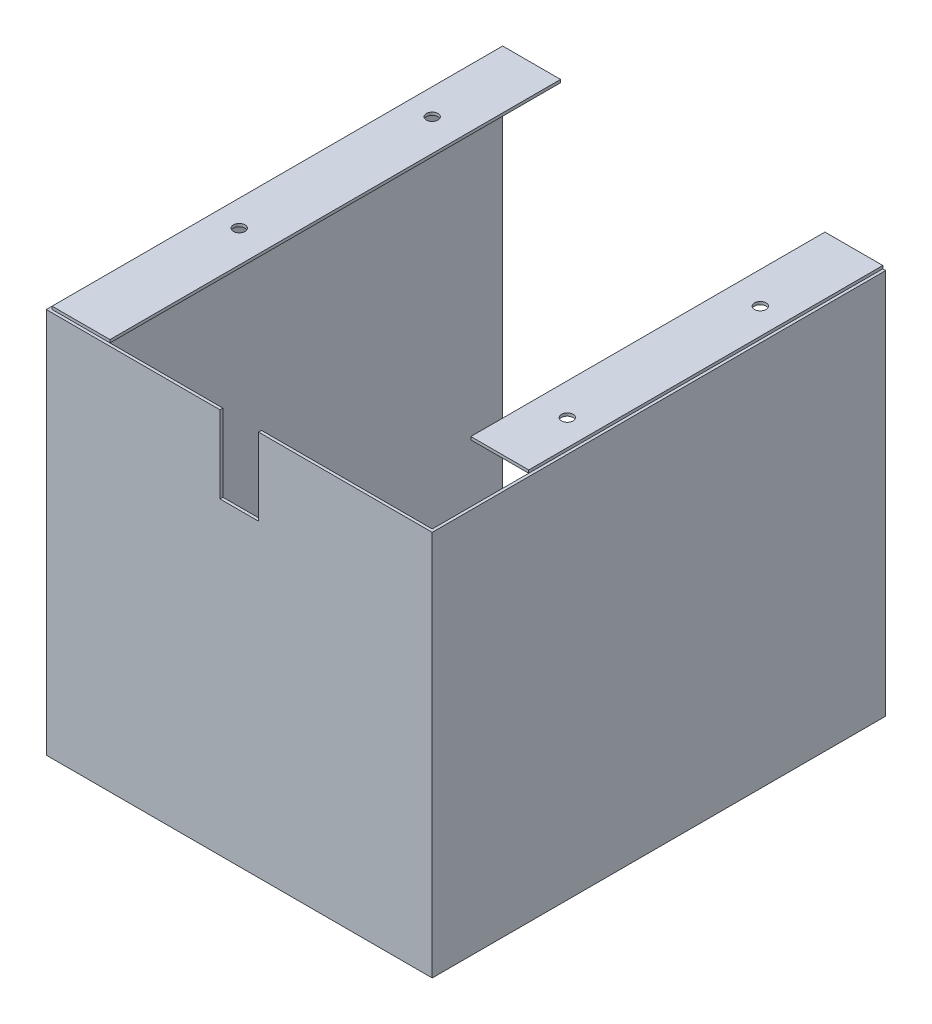
ISO-10303-21;
HEADER;
FILE_DESCRIPTION(('STEP AP214'),'2;1');
FILE_NAME('part.step','',(''),(''),'','','');
FILE_SCHEMA(('AUTOMOTIVE_DESIGN { 1 0 10303 214 1 1 1 1 }'));
ENDSEC;
DATA;
#1=APPLICATION_CONTEXT('core data for automotive mechanical design processes');
#2=APPLICATION_PROTOCOL_DEFINITION('international standard','automotive_design',2000,#1);
#3=PRODUCT_CONTEXT('',#1,'mechanical');
#4=PRODUCT('Part','Part','',(#3));
#5=PRODUCT_RELATED_PRODUCT_CATEGORY('part','',(#4));
#6=PRODUCT_DEFINITION_FORMATION('','',#4);
#7=PRODUCT_DEFINITION_CONTEXT('part definition',#1,'design');
#8=PRODUCT_DEFINITION('design','',#6,#7);
#9=PRODUCT_DEFINITION_SHAPE('','',#8);
#10=(LENGTH_UNIT() NAMED_UNIT(*) SI_UNIT(.MILLI.,.METRE.));
#11=(NAMED_UNIT(*) PLANE_ANGLE_UNIT() SI_UNIT($,.RADIAN.));
#12=(NAMED_UNIT(*) SI_UNIT($,.STERADIAN.) SOLID_ANGLE_UNIT());
#13=UNCERTAINTY_MEASURE_WITH_UNIT(LENGTH_MEASURE(1.E-05),#10,'distance_accuracy_value','');
#14=(GEOMETRIC_REPRESENTATION_CONTEXT(3) GLOBAL_UNCERTAINTY_ASSIGNED_CONTEXT((#13)) GLOBAL_UNIT_ASSIGNED_CONTEXT((#10,
#11,#12)) REPRESENTATION_CONTEXT('',''));
#15=CARTESIAN_POINT('',(0.,0.,0.));
#16=DIRECTION('',(0.,0.,1.));
#17=DIRECTION('',(1.,0.,0.));
#18=AXIS2_PLACEMENT_3D('',#15,#16,#17);
#19=CARTESIAN_POINT('',(98.5,101.5,0.));
#20=DIRECTION('',(-1.,0.,0.));
#21=DIRECTION('',(0.,-1.,0.));
#22=AXIS2_PLACEMENT_3D('',#19,#20,#21);
#23=PLANE('',#22);
#24=DIRECTION('',(0.,0.,-1.));
#25=VECTOR('',#24,1.);
#26=CARTESIAN_POINT('',(98.5,100.,0.));
#27=LINE('',#26,#25);
#28=CARTESIAN_POINT('',(98.5,100.,183.5));
#29=VERTEX_POINT('',#28);
#30=CARTESIAN_POINT('',(98.5,100.,0.));
#31=VERTEX_POINT('',#30);
#32=EDGE_CURVE('E107',#29,#31,#27,.T.);
#33=ORIENTED_EDGE('',*,*,#32,.T.);
#34=DIRECTION('',(0.,-1.,0.));
#35=VECTOR('',#34,1.);
#36=CARTESIAN_POINT('',(98.5,101.5,0.));
#37=LINE('',#36,#35);
#38=CARTESIAN_POINT('',(98.5,101.5,0.));
#39=VERTEX_POINT('',#38);
#40=EDGE_CURVE('E12',#39,#31,#37,.T.);
#41=ORIENTED_EDGE('',*,*,#40,.F.);
#42=DIRECTION('',(0.,0.,-1.));
#43=VECTOR('',#42,1.);
#44=CARTESIAN_POINT('',(98.5,101.5,0.));
#45=LINE('',#44,#43);
#46=CARTESIAN_POINT('',(98.5,101.5,183.5));
#47=VERTEX_POINT('',#46);
#48=EDGE_CURVE('E95',#47,#39,#45,.T.);
#49=ORIENTED_EDGE('',*,*,#48,.F.);
#50=DIRECTION('',(0.,-1.,0.));
#51=VECTOR('',#50,1.);
#52=CARTESIAN_POINT('',(98.5,101.5,183.5));
#53=LINE('',#52,#51);
#54=EDGE_CURVE('E103',#47,#29,#53,.T.);
#55=ORIENTED_EDGE('',*,*,#54,.T.);
#56=EDGE_LOOP('',(#33,#41,#49,#55));
#57=FACE_BOUND('',#56,.T.);
#58=ADVANCED_FACE('F44',(#57),#23,.F.);
#59=CARTESIAN_POINT('',(98.5,101.5,0.));
#60=DIRECTION('',(0.,0.,1.));
#61=DIRECTION('',(1.,0.,0.));
#62=AXIS2_PLACEMENT_3D('',#59,#60,#61);
#63=PLANE('',#62);
#64=DIRECTION('',(-1.,0.,0.));
#65=VECTOR('',#64,1.);
#66=CARTESIAN_POINT('',(98.5,100.,0.));
#67=LINE('',#66,#65);
#68=CARTESIAN_POINT('',(68.5,100.,0.));
#69=VERTEX_POINT('',#68);
#70=EDGE_CURVE('E99',#31,#69,#67,.T.);
#71=ORIENTED_EDGE('',*,*,#70,.T.);
#72=DIRECTION('',(0.,-1.,0.));
#73=VECTOR('',#72,1.);
#74=CARTESIAN_POINT('',(68.5,101.5,0.));
#75=LINE('',#74,#73);
#76=CARTESIAN_POINT('',(68.5,101.5,0.));
#77=VERTEX_POINT('',#76);
#78=EDGE_CURVE('E52',#77,#69,#75,.T.);
#79=ORIENTED_EDGE('',*,*,#78,.F.);
#80=DIRECTION('',(-1.,0.,0.));
#81=VECTOR('',#80,1.);
#82=CARTESIAN_POINT('',(98.5,101.5,0.));
#83=LINE('',#82,#81);
#84=EDGE_CURVE('E90',#39,#77,#83,.T.);
#85=ORIENTED_EDGE('',*,*,#84,.F.);
#86=ORIENTED_EDGE('',*,*,#40,.T.);
#87=EDGE_LOOP('',(#71,#79,#85,#86));
#88=FACE_BOUND('',#87,.T.);
#89=ADVANCED_FACE('F98',(#88),#63,.F.);
#90=CARTESIAN_POINT('',(68.5,101.5,0.));
#91=DIRECTION('',(1.,0.,0.));
#92=DIRECTION('',(0.,0.,-1.));
#93=AXIS2_PLACEMENT_3D('',#90,#91,#92);
#94=PLANE('',#93);
#95=DIRECTION('',(0.,0.,1.));
#96=VECTOR('',#95,1.);
#97=CARTESIAN_POINT('',(68.5,100.,0.));
#98=LINE('',#97,#96);
#99=CARTESIAN_POINT('',(68.5,100.,183.5));
#100=VERTEX_POINT('',#99);
#101=EDGE_CURVE('E77',#69,#100,#98,.T.);
#102=ORIENTED_EDGE('',*,*,#101,.T.);
#103=DIRECTION('',(0.,-1.,0.));
#104=VECTOR('',#103,1.);
#105=CARTESIAN_POINT('',(68.5,101.5,183.5));
#106=LINE('',#105,#104);
#107=CARTESIAN_POINT('',(68.5,101.5,183.5));
#108=VERTEX_POINT('',#107);
#109=EDGE_CURVE('E100',#108,#100,#106,.T.);
#110=ORIENTED_EDGE('',*,*,#109,.F.);
#111=DIRECTION('',(0.,0.,1.));
#112=VECTOR('',#111,1.);
#113=CARTESIAN_POINT('',(68.5,101.5,0.));
#114=LINE('',#113,#112);
#115=EDGE_CURVE('E93',#77,#108,#114,.T.);
#116=ORIENTED_EDGE('',*,*,#115,.F.);
#117=ORIENTED_EDGE('',*,*,#78,.T.);
#118=EDGE_LOOP('',(#102,#110,#116,#117));
#119=FACE_BOUND('',#118,.T.);
#120=ADVANCED_FACE('F101',(#119),#94,.F.);
#121=CARTESIAN_POINT('',(68.5,101.5,183.5));
#122=DIRECTION('',(0.,0.,-1.));
#123=DIRECTION('',(-1.,0.,0.));
#124=AXIS2_PLACEMENT_3D('',#121,#122,#123);
#125=PLANE('',#124);
#126=DIRECTION('',(1.,0.,0.));
#127=VECTOR('',#126,1.);
#128=CARTESIAN_POINT('',(68.5,100.,183.5));
#129=LINE('',#128,#127);
#130=EDGE_CURVE('E83',#100,#29,#129,.T.);
#131=ORIENTED_EDGE('',*,*,#130,.T.);
#132=ORIENTED_EDGE('',*,*,#54,.F.);
#133=DIRECTION('',(1.,0.,0.));
#134=VECTOR('',#133,1.);
#135=CARTESIAN_POINT('',(68.5,101.5,183.5));
#136=LINE('',#135,#134);
#137=EDGE_CURVE('E60',#108,#47,#136,.T.);
#138=ORIENTED_EDGE('',*,*,#137,.F.);
#139=ORIENTED_EDGE('',*,*,#109,.T.);
#140=EDGE_LOOP('',(#131,#132,#138,#139));
#141=FACE_BOUND('',#140,.T.);
#142=ADVANCED_FACE('F115',(#141),#125,.F.);
#143=CARTESIAN_POINT('',(0.,101.5,0.));
#144=DIRECTION('',(0.,1.,0.));
#145=DIRECTION('',(0.,0.,1.));
#146=AXIS2_PLACEMENT_3D('',#143,#144,#145);
#147=PLANE('',#146);
#148=CARTESIAN_POINT('',(85.0000000000001,101.5,150.));
#149=DIRECTION('',(0.,1.,0.));
#150=DIRECTION('',(0.,0.,-1.));
#151=AXIS2_PLACEMENT_3D('',#148,#149,#150);
#152=CIRCLE('',#151,3.00000000000001);
#153=CARTESIAN_POINT('',(85.0000000000001,101.5,147.));
#154=VERTEX_POINT('',#153);
#155=EDGE_CURVE('E127',#154,#154,#152,.T.);
#156=ORIENTED_EDGE('',*,*,#155,.F.);
#157=EDGE_LOOP('',(#156));
#158=FACE_BOUND('',#157,.T.);
#159=CARTESIAN_POINT('',(85.,101.5,50.));
#160=DIRECTION('',(0.,1.,0.));
#161=DIRECTION('',(0.,0.,-1.));
#162=AXIS2_PLACEMENT_3D('',#159,#160,#161);
#163=CIRCLE('',#162,3.00000000000001);
#164=CARTESIAN_POINT('',(85.,101.5,47.));
#165=VERTEX_POINT('',#164);
#166=EDGE_CURVE('E121',#165,#165,#163,.T.);
#167=ORIENTED_EDGE('',*,*,#166,.F.);
#168=EDGE_LOOP('',(#167));
#169=FACE_BOUND('',#168,.T.);
#170=ORIENTED_EDGE('',*,*,#48,.T.);
#171=ORIENTED_EDGE('',*,*,#84,.T.);
#172=ORIENTED_EDGE('',*,*,#115,.T.);
#173=ORIENTED_EDGE('',*,*,#137,.T.);
#174=EDGE_LOOP('',(#170,#171,#172,#173));
#175=FACE_BOUND('',#174,.T.);
#176=ADVANCED_FACE('F91',(#158,#169,#175),#147,.T.);
#177=CARTESIAN_POINT('',(0.,100.,0.));
#178=DIRECTION('',(0.,1.,0.));
#179=DIRECTION('',(0.,0.,1.));
#180=AXIS2_PLACEMENT_3D('',#177,#178,#179);
#181=PLANE('',#180);
#182=CARTESIAN_POINT('',(85.0000000000001,100.,150.));
#183=DIRECTION('',(0.,1.,0.));
#184=DIRECTION('',(0.,0.,-1.));
#185=AXIS2_PLACEMENT_3D('',#182,#183,#184);
#186=CIRCLE('',#185,3.00000000000001);
#187=CARTESIAN_POINT('',(85.0000000000001,100.,147.));
#188=VERTEX_POINT('',#187);
#189=EDGE_CURVE('E110',#188,#188,#186,.T.);
#190=ORIENTED_EDGE('',*,*,#189,.T.);
#191=EDGE_LOOP('',(#190));
#192=FACE_BOUND('',#191,.T.);
#193=CARTESIAN_POINT('',(85.,100.,50.));
#194=DIRECTION('',(0.,1.,0.));
#195=DIRECTION('',(0.,0.,-1.));
#196=AXIS2_PLACEMENT_3D('',#193,#194,#195);
#197=CIRCLE('',#196,3.00000000000001);
#198=CARTESIAN_POINT('',(85.,100.,47.));
#199=VERTEX_POINT('',#198);
#200=EDGE_CURVE('E124',#199,#199,#197,.T.);
#201=ORIENTED_EDGE('',*,*,#200,.T.);
#202=EDGE_LOOP('',(#201));
#203=FACE_BOUND('',#202,.T.);
#204=ORIENTED_EDGE('',*,*,#32,.F.);
#205=ORIENTED_EDGE('',*,*,#130,.F.);
#206=ORIENTED_EDGE('',*,*,#101,.F.);
#207=ORIENTED_EDGE('',*,*,#70,.F.);
#208=EDGE_LOOP('',(#204,#205,#206,#207));
#209=FACE_BOUND('',#208,.T.);
#210=ADVANCED_FACE('F118',(#192,#203,#209),#181,.F.);
#211=CARTESIAN_POINT('',(85.,100.,50.));
#212=DIRECTION('',(0.,1.,0.));
#213=DIRECTION('',(0.,0.,1.));
#214=AXIS2_PLACEMENT_3D('',#211,#212,#213);
#215=CYLINDRICAL_SURFACE('',#214,3.00000000000001);
#216=ORIENTED_EDGE('',*,*,#200,.F.);
#217=EDGE_LOOP('',(#216));
#218=FACE_BOUND('',#217,.T.);
#219=ORIENTED_EDGE('',*,*,#166,.T.);
#220=EDGE_LOOP('',(#219));
#221=FACE_BOUND('',#220,.T.);
#222=ADVANCED_FACE('F138',(#218,#221),#215,.F.);
#223=CARTESIAN_POINT('',(85.0000000000001,100.,150.));
#224=DIRECTION('',(0.,1.,0.));
#225=DIRECTION('',(0.,0.,1.));
#226=AXIS2_PLACEMENT_3D('',#223,#224,#225);
#227=CYLINDRICAL_SURFACE('',#226,3.00000000000001);
#228=ORIENTED_EDGE('',*,*,#189,.F.);
#229=EDGE_LOOP('',(#228));
#230=FACE_BOUND('',#229,.T.);
#231=ORIENTED_EDGE('',*,*,#155,.T.);
#232=EDGE_LOOP('',(#231));
#233=FACE_BOUND('',#232,.T.);
#234=ADVANCED_FACE('F135',(#230,#233),#227,.F.);
#235=CLOSED_SHELL('',(#58,#89,#120,#142,#176,#210,#222,#234));
#236=MANIFOLD_SOLID_BREP('B2',#235);
#237=CARTESIAN_POINT('',(-98.5,101.5,0.));
#238=DIRECTION('',(1.,0.,0.));
#239=DIRECTION('',(0.,1.,0.));
#240=AXIS2_PLACEMENT_3D('',#237,#238,#239);
#241=PLANE('',#240);
#242=DIRECTION('',(0.,0.,1.));
#243=VECTOR('',#242,1.);
#244=CARTESIAN_POINT('',(-98.5,100.,0.));
#245=LINE('',#244,#243);
#246=CARTESIAN_POINT('',(-98.5,100.,0.));
#247=VERTEX_POINT('',#246);
#248=CARTESIAN_POINT('',(-98.5,100.,233.5));
#249=VERTEX_POINT('',#248);
#250=EDGE_CURVE('E282',#247,#249,#245,.T.);
#251=ORIENTED_EDGE('',*,*,#250,.T.);
#252=DIRECTION('',(0.,-1.,0.));
#253=VECTOR('',#252,1.);
#254=CARTESIAN_POINT('',(-98.5,101.5,233.5));
#255=LINE('',#254,#253);
#256=CARTESIAN_POINT('',(-98.5,101.5,233.5));
#257=VERTEX_POINT('',#256);
#258=EDGE_CURVE('E42',#257,#249,#255,.T.);
#259=ORIENTED_EDGE('',*,*,#258,.F.);
#260=DIRECTION('',(0.,0.,1.));
#261=VECTOR('',#260,1.);
#262=CARTESIAN_POINT('',(-98.5,101.5,0.));
#263=LINE('',#262,#261);
#264=CARTESIAN_POINT('',(-98.5,101.5,0.));
#265=VERTEX_POINT('',#264);
#266=EDGE_CURVE('E270',#265,#257,#263,.T.);
#267=ORIENTED_EDGE('',*,*,#266,.F.);
#268=DIRECTION('',(0.,-1.,0.));
#269=VECTOR('',#268,1.);
#270=CARTESIAN_POINT('',(-98.5,101.5,0.));
#271=LINE('',#270,#269);
#272=EDGE_CURVE('E278',#265,#247,#271,.T.);
#273=ORIENTED_EDGE('',*,*,#272,.T.);
#274=EDGE_LOOP('',(#251,#259,#267,#273));
#275=FACE_BOUND('',#274,.T.);
#276=ADVANCED_FACE('F219',(#275),#241,.F.);
#277=CARTESIAN_POINT('',(-98.5,101.5,233.5));
#278=DIRECTION('',(0.,0.,-1.));
#279=DIRECTION('',(-1.,0.,0.));
#280=AXIS2_PLACEMENT_3D('',#277,#278,#279);
#281=PLANE('',#280);
#282=DIRECTION('',(1.,0.,0.));
#283=VECTOR('',#282,1.);
#284=CARTESIAN_POINT('',(-98.5,100.,233.5));
#285=LINE('',#284,#283);
#286=CARTESIAN_POINT('',(-68.5,100.,233.5));
#287=VERTEX_POINT('',#286);
#288=EDGE_CURVE('E274',#249,#287,#285,.T.);
#289=ORIENTED_EDGE('',*,*,#288,.T.);
#290=DIRECTION('',(0.,-1.,0.));
#291=VECTOR('',#290,1.);
#292=CARTESIAN_POINT('',(-68.5,101.5,233.5));
#293=LINE('',#292,#291);
#294=CARTESIAN_POINT('',(-68.5,101.5,233.5));
#295=VERTEX_POINT('',#294);
#296=EDGE_CURVE('E227',#295,#287,#293,.T.);
#297=ORIENTED_EDGE('',*,*,#296,.F.);
#298=DIRECTION('',(1.,0.,0.));
#299=VECTOR('',#298,1.);
#300=CARTESIAN_POINT('',(-98.5,101.5,233.5));
#301=LINE('',#300,#299);
#302=EDGE_CURVE('E265',#257,#295,#301,.T.);
#303=ORIENTED_EDGE('',*,*,#302,.F.);
#304=ORIENTED_EDGE('',*,*,#258,.T.);
#305=EDGE_LOOP('',(#289,#297,#303,#304));
#306=FACE_BOUND('',#305,.T.);
#307=ADVANCED_FACE('F273',(#306),#281,.F.);
#308=CARTESIAN_POINT('',(-68.5,101.5,0.));
#309=DIRECTION('',(-1.,0.,0.));
#310=DIRECTION('',(0.,-1.,0.));
#311=AXIS2_PLACEMENT_3D('',#308,#309,#310);
#312=PLANE('',#311);
#313=DIRECTION('',(0.,0.,-1.));
#314=VECTOR('',#313,1.);
#315=CARTESIAN_POINT('',(-68.5,100.,0.));
#316=LINE('',#315,#314);
#317=CARTESIAN_POINT('',(-68.5,100.,0.));
#318=VERTEX_POINT('',#317);
#319=EDGE_CURVE('E252',#287,#318,#316,.T.);
#320=ORIENTED_EDGE('',*,*,#319,.T.);
#321=DIRECTION('',(0.,-1.,0.));
#322=VECTOR('',#321,1.);
#323=CARTESIAN_POINT('',(-68.5,101.5,0.));
#324=LINE('',#323,#322);
#325=CARTESIAN_POINT('',(-68.5,101.5,0.));
#326=VERTEX_POINT('',#325);
#327=EDGE_CURVE('E275',#326,#318,#324,.T.);
#328=ORIENTED_EDGE('',*,*,#327,.F.);
#329=DIRECTION('',(0.,0.,-1.));
#330=VECTOR('',#329,1.);
#331=CARTESIAN_POINT('',(-68.5,101.5,0.));
#332=LINE('',#331,#330);
#333=EDGE_CURVE('E268',#295,#326,#332,.T.);
#334=ORIENTED_EDGE('',*,*,#333,.F.);
#335=ORIENTED_EDGE('',*,*,#296,.T.);
#336=EDGE_LOOP('',(#320,#328,#334,#335));
#337=FACE_BOUND('',#336,.T.);
#338=ADVANCED_FACE('F276',(#337),#312,.F.);
#339=CARTESIAN_POINT('',(-98.5,101.5,0.));
#340=DIRECTION('',(0.,0.,1.));
#341=DIRECTION('',(1.,0.,0.));
#342=AXIS2_PLACEMENT_3D('',#339,#340,#341);
#343=PLANE('',#342);
#344=DIRECTION('',(-1.,0.,0.));
#345=VECTOR('',#344,1.);
#346=CARTESIAN_POINT('',(-98.5,100.,0.));
#347=LINE('',#346,#345);
#348=EDGE_CURVE('E258',#318,#247,#347,.T.);
#349=ORIENTED_EDGE('',*,*,#348,.T.);
#350=ORIENTED_EDGE('',*,*,#272,.F.);
#351=DIRECTION('',(-1.,0.,0.));
#352=VECTOR('',#351,1.);
#353=CARTESIAN_POINT('',(-98.5,101.5,0.));
#354=LINE('',#353,#352);
#355=EDGE_CURVE('E235',#326,#265,#354,.T.);
#356=ORIENTED_EDGE('',*,*,#355,.F.);
#357=ORIENTED_EDGE('',*,*,#327,.T.);
#358=EDGE_LOOP('',(#349,#350,#356,#357));
#359=FACE_BOUND('',#358,.T.);
#360=ADVANCED_FACE('F290',(#359),#343,.F.);
#361=CARTESIAN_POINT('',(0.,101.5,0.));
#362=DIRECTION('',(0.,1.,0.));
#363=DIRECTION('',(0.,0.,1.));
#364=AXIS2_PLACEMENT_3D('',#361,#362,#363);
#365=PLANE('',#364);
#366=CARTESIAN_POINT('',(-85.,101.5,50.));
#367=DIRECTION('',(0.,1.,0.));
#368=DIRECTION('',(0.,0.,1.));
#369=AXIS2_PLACEMENT_3D('',#366,#367,#368);
#370=CIRCLE('',#369,3.00000000000001);
#371=CARTESIAN_POINT('',(-85.,101.5,53.));
#372=VERTEX_POINT('',#371);
#373=EDGE_CURVE('E302',#372,#372,#370,.T.);
#374=ORIENTED_EDGE('',*,*,#373,.F.);
#375=EDGE_LOOP('',(#374));
#376=FACE_BOUND('',#375,.T.);
#377=CARTESIAN_POINT('',(-85.,101.5,150.));
#378=DIRECTION('',(0.,1.,0.));
#379=DIRECTION('',(0.,0.,1.));
#380=AXIS2_PLACEMENT_3D('',#377,#378,#379);
#381=CIRCLE('',#380,3.00000000000001);
#382=CARTESIAN_POINT('',(-85.,101.5,153.));
#383=VERTEX_POINT('',#382);
#384=EDGE_CURVE('E296',#383,#383,#381,.T.);
#385=ORIENTED_EDGE('',*,*,#384,.F.);
#386=EDGE_LOOP('',(#385));
#387=FACE_BOUND('',#386,.T.);
#388=ORIENTED_EDGE('',*,*,#266,.T.);
#389=ORIENTED_EDGE('',*,*,#302,.T.);
#390=ORIENTED_EDGE('',*,*,#333,.T.);
#391=ORIENTED_EDGE('',*,*,#355,.T.);
#392=EDGE_LOOP('',(#388,#389,#390,#391));
#393=FACE_BOUND('',#392,.T.);
#394=ADVANCED_FACE('F266',(#376,#387,#393),#365,.T.);
#395=CARTESIAN_POINT('',(0.,100.,0.));
#396=DIRECTION('',(0.,1.,0.));
#397=DIRECTION('',(0.,0.,1.));
#398=AXIS2_PLACEMENT_3D('',#395,#396,#397);
#399=PLANE('',#398);
#400=CARTESIAN_POINT('',(-85.,100.,50.));
#401=DIRECTION('',(0.,1.,0.));
#402=DIRECTION('',(0.,0.,1.));
#403=AXIS2_PLACEMENT_3D('',#400,#401,#402);
#404=CIRCLE('',#403,3.00000000000001);
#405=CARTESIAN_POINT('',(-85.,100.,53.));
#406=VERTEX_POINT('',#405);
#407=EDGE_CURVE('E285',#406,#406,#404,.T.);
#408=ORIENTED_EDGE('',*,*,#407,.T.);
#409=EDGE_LOOP('',(#408));
#410=FACE_BOUND('',#409,.T.);
#411=CARTESIAN_POINT('',(-85.,100.,150.));
#412=DIRECTION('',(0.,1.,0.));
#413=DIRECTION('',(0.,0.,1.));
#414=AXIS2_PLACEMENT_3D('',#411,#412,#413);
#415=CIRCLE('',#414,3.00000000000001);
#416=CARTESIAN_POINT('',(-85.,100.,153.));
#417=VERTEX_POINT('',#416);
#418=EDGE_CURVE('E299',#417,#417,#415,.T.);
#419=ORIENTED_EDGE('',*,*,#418,.T.);
#420=EDGE_LOOP('',(#419));
#421=FACE_BOUND('',#420,.T.);
#422=ORIENTED_EDGE('',*,*,#250,.F.);
#423=ORIENTED_EDGE('',*,*,#348,.F.);
#424=ORIENTED_EDGE('',*,*,#319,.F.);
#425=ORIENTED_EDGE('',*,*,#288,.F.);
#426=EDGE_LOOP('',(#422,#423,#424,#425));
#427=FACE_BOUND('',#426,.T.);
#428=ADVANCED_FACE('F293',(#410,#421,#427),#399,.F.);
#429=CARTESIAN_POINT('',(-85.,100.,150.));
#430=DIRECTION('',(0.,1.,0.));
#431=DIRECTION('',(0.,0.,1.));
#432=AXIS2_PLACEMENT_3D('',#429,#430,#431);
#433=CYLINDRICAL_SURFACE('',#432,3.00000000000001);
#434=ORIENTED_EDGE('',*,*,#418,.F.);
#435=EDGE_LOOP('',(#434));
#436=FACE_BOUND('',#435,.T.);
#437=ORIENTED_EDGE('',*,*,#384,.T.);
#438=EDGE_LOOP('',(#437));
#439=FACE_BOUND('',#438,.T.);
#440=ADVANCED_FACE('F313',(#436,#439),#433,.F.);
#441=CARTESIAN_POINT('',(-85.,100.,50.));
#442=DIRECTION('',(0.,1.,0.));
#443=DIRECTION('',(0.,0.,1.));
#444=AXIS2_PLACEMENT_3D('',#441,#442,#443);
#445=CYLINDRICAL_SURFACE('',#444,3.00000000000001);
#446=ORIENTED_EDGE('',*,*,#407,.F.);
#447=EDGE_LOOP('',(#446));
#448=FACE_BOUND('',#447,.T.);
#449=ORIENTED_EDGE('',*,*,#373,.T.);
#450=EDGE_LOOP('',(#449));
#451=FACE_BOUND('',#450,.T.);
#452=ADVANCED_FACE('F310',(#448,#451),#445,.F.);
#453=CLOSED_SHELL('',(#276,#307,#338,#360,#394,#428,#440,#452));
#454=MANIFOLD_SOLID_BREP('B6',#453);
#455=CARTESIAN_POINT('',(100.,100.,235.));
#456=DIRECTION('',(0.,-1.,0.));
#457=DIRECTION('',(1.,0.,0.));
#458=AXIS2_PLACEMENT_3D('',#455,#456,#457);
#459=PLANE('',#458);
#460=DIRECTION('',(-1.,0.,0.));
#461=VECTOR('',#460,1.);
#462=CARTESIAN_POINT('',(100.,100.,235.));
#463=LINE('',#462,#461);
#464=CARTESIAN_POINT('',(-10.,100.,235.));
#465=VERTEX_POINT('',#464);
#466=CARTESIAN_POINT('',(-100.,100.,235.));
#467=VERTEX_POINT('',#466);
#468=EDGE_CURVE('E545',#465,#467,#463,.T.);
#469=ORIENTED_EDGE('',*,*,#468,.F.);
#470=DIRECTION('',(0.,0.,1.));
#471=VECTOR('',#470,1.);
#472=CARTESIAN_POINT('',(-10.,100.,-0.001000000000001));
#473=LINE('',#472,#471);
#474=CARTESIAN_POINT('',(-10.,100.,233.5));
#475=VERTEX_POINT('',#474);
#476=EDGE_CURVE('E492',#475,#465,#473,.T.);
#477=ORIENTED_EDGE('',*,*,#476,.F.);
#478=DIRECTION('',(-1.,0.,0.));
#479=VECTOR('',#478,1.);
#480=CARTESIAN_POINT('',(100.,100.,233.5));
#481=LINE('',#480,#479);
#482=CARTESIAN_POINT('',(-98.5,100.,233.5));
#483=VERTEX_POINT('',#482);
#484=EDGE_CURVE('E497',#475,#483,#481,.T.);
#485=ORIENTED_EDGE('',*,*,#484,.T.);
#486=DIRECTION('',(0.,0.,-1.));
#487=VECTOR('',#486,1.);
#488=CARTESIAN_POINT('',(-98.5,100.,235.));
#489=LINE('',#488,#487);
#490=CARTESIAN_POINT('',(-98.5,100.,0.));
#491=VERTEX_POINT('',#490);
#492=EDGE_CURVE('E527',#483,#491,#489,.T.);
#493=ORIENTED_EDGE('',*,*,#492,.T.);
#494=DIRECTION('',(-1.,0.,0.));
#495=VECTOR('',#494,1.);
#496=CARTESIAN_POINT('',(100.,100.,0.));
#497=LINE('',#496,#495);
#498=CARTESIAN_POINT('',(-100.,100.,0.));
#499=VERTEX_POINT('',#498);
#500=EDGE_CURVE('E556',#491,#499,#497,.T.);
#501=ORIENTED_EDGE('',*,*,#500,.T.);
#502=DIRECTION('',(0.,0.,-1.));
#503=VECTOR('',#502,1.);
#504=CARTESIAN_POINT('',(-100.,100.,235.));
#505=LINE('',#504,#503);
#506=EDGE_CURVE('E549',#467,#499,#505,.T.);
#507=ORIENTED_EDGE('',*,*,#506,.F.);
#508=EDGE_LOOP('',(#469,#477,#485,#493,#501,#507));
#509=FACE_BOUND('',#508,.T.);
#510=ADVANCED_FACE('F384',(#509),#459,.F.);
#511=CARTESIAN_POINT('',(-100.,-100.,235.));
#512=DIRECTION('',(1.,0.,0.));
#513=DIRECTION('',(0.,0.,-1.));
#514=AXIS2_PLACEMENT_3D('',#511,#512,#513);
#515=PLANE('',#514);
#516=DIRECTION('',(0.,-1.,0.));
#517=VECTOR('',#516,1.);
#518=CARTESIAN_POINT('',(-100.,-100.,0.));
#519=LINE('',#518,#517);
#520=CARTESIAN_POINT('',(-100.,-100.,0.));
#521=VERTEX_POINT('',#520);
#522=EDGE_CURVE('E513',#499,#521,#519,.T.);
#523=ORIENTED_EDGE('',*,*,#522,.T.);
#524=DIRECTION('',(0.,0.,-1.));
#525=VECTOR('',#524,1.);
#526=CARTESIAN_POINT('',(-100.,-100.,235.));
#527=LINE('',#526,#525);
#528=CARTESIAN_POINT('',(-100.,-100.,235.));
#529=VERTEX_POINT('',#528);
#530=EDGE_CURVE('E217',#529,#521,#527,.T.);
#531=ORIENTED_EDGE('',*,*,#530,.F.);
#532=DIRECTION('',(0.,-1.,0.));
#533=VECTOR('',#532,1.);
#534=CARTESIAN_POINT('',(-100.,-100.,235.));
#535=LINE('',#534,#533);
#536=EDGE_CURVE('E537',#467,#529,#535,.T.);
#537=ORIENTED_EDGE('',*,*,#536,.F.);
#538=ORIENTED_EDGE('',*,*,#506,.T.);
#539=EDGE_LOOP('',(#523,#531,#537,#538));
#540=FACE_BOUND('',#539,.T.);
#541=ADVANCED_FACE('F386',(#540),#515,.F.);
#542=CARTESIAN_POINT('',(100.,-100.,235.));
#543=DIRECTION('',(0.,1.,0.));
#544=DIRECTION('',(-1.,0.,0.));
#545=AXIS2_PLACEMENT_3D('',#542,#543,#544);
#546=PLANE('',#545);
#547=DIRECTION('',(1.,0.,0.));
#548=VECTOR('',#547,1.);
#549=CARTESIAN_POINT('',(100.,-100.,0.));
#550=LINE('',#549,#548);
#551=CARTESIAN_POINT('',(100.,-100.,0.));
#552=VERTEX_POINT('',#551);
#553=EDGE_CURVE('E552',#521,#552,#550,.T.);
#554=ORIENTED_EDGE('',*,*,#553,.T.);
#555=DIRECTION('',(0.,0.,-1.));
#556=VECTOR('',#555,1.);
#557=CARTESIAN_POINT('',(100.,-100.,235.));
#558=LINE('',#557,#556);
#559=CARTESIAN_POINT('',(100.,-100.,235.));
#560=VERTEX_POINT('',#559);
#561=EDGE_CURVE('E392',#560,#552,#558,.T.);
#562=ORIENTED_EDGE('',*,*,#561,.F.);
#563=DIRECTION('',(1.,0.,0.));
#564=VECTOR('',#563,1.);
#565=CARTESIAN_POINT('',(100.,-100.,235.));
#566=LINE('',#565,#564);
#567=EDGE_CURVE('E540',#529,#560,#566,.T.);
#568=ORIENTED_EDGE('',*,*,#567,.F.);
#569=ORIENTED_EDGE('',*,*,#530,.T.);
#570=EDGE_LOOP('',(#554,#562,#568,#569));
#571=FACE_BOUND('',#570,.T.);
#572=ADVANCED_FACE('F585',(#571),#546,.F.);
#573=CARTESIAN_POINT('',(100.,-100.,235.));
#574=DIRECTION('',(-1.,0.,0.));
#575=DIRECTION('',(0.,0.,1.));
#576=AXIS2_PLACEMENT_3D('',#573,#574,#575);
#577=PLANE('',#576);
#578=DIRECTION('',(0.,1.,0.));
#579=VECTOR('',#578,1.);
#580=CARTESIAN_POINT('',(100.,-100.,0.));
#581=LINE('',#580,#579);
#582=CARTESIAN_POINT('',(100.,100.,0.));
#583=VERTEX_POINT('',#582);
#584=EDGE_CURVE('E554',#552,#583,#581,.T.);
#585=ORIENTED_EDGE('',*,*,#584,.T.);
#586=DIRECTION('',(0.,0.,-1.));
#587=VECTOR('',#586,1.);
#588=CARTESIAN_POINT('',(100.,100.,235.));
#589=LINE('',#588,#587);
#590=CARTESIAN_POINT('',(100.,100.,235.));
#591=VERTEX_POINT('',#590);
#592=EDGE_CURVE('E561',#591,#583,#589,.T.);
#593=ORIENTED_EDGE('',*,*,#592,.F.);
#594=DIRECTION('',(0.,1.,0.));
#595=VECTOR('',#594,1.);
#596=CARTESIAN_POINT('',(100.,-100.,235.));
#597=LINE('',#596,#595);
#598=EDGE_CURVE('E543',#560,#591,#597,.T.);
#599=ORIENTED_EDGE('',*,*,#598,.F.);
#600=ORIENTED_EDGE('',*,*,#561,.T.);
#601=EDGE_LOOP('',(#585,#593,#599,#600));
#602=FACE_BOUND('',#601,.T.);
#603=ADVANCED_FACE('F568',(#602),#577,.F.);
#604=CARTESIAN_POINT('',(98.5,100.,233.5));
#605=VERTEX_POINT('',#604);
#606=CARTESIAN_POINT('',(10.,100.,233.5));
#607=VERTEX_POINT('',#606);
#608=EDGE_CURVE('E530',#605,#607,#481,.T.);
#609=ORIENTED_EDGE('',*,*,#608,.T.);
#610=DIRECTION('',(0.,0.,1.));
#611=VECTOR('',#610,1.);
#612=CARTESIAN_POINT('',(10.,100.,-0.001000000000001));
#613=LINE('',#612,#611);
#614=CARTESIAN_POINT('',(10.,100.,235.));
#615=VERTEX_POINT('',#614);
#616=EDGE_CURVE('E506',#607,#615,#613,.T.);
#617=ORIENTED_EDGE('',*,*,#616,.T.);
#618=EDGE_CURVE('E546',#591,#615,#463,.T.);
#619=ORIENTED_EDGE('',*,*,#618,.F.);
#620=ORIENTED_EDGE('',*,*,#592,.T.);
#621=CARTESIAN_POINT('',(98.5,100.,0.));
#622=VERTEX_POINT('',#621);
#623=EDGE_CURVE('E541',#583,#622,#497,.T.);
#624=ORIENTED_EDGE('',*,*,#623,.T.);
#625=DIRECTION('',(0.,0.,-1.));
#626=VECTOR('',#625,1.);
#627=CARTESIAN_POINT('',(98.5,100.,235.));
#628=LINE('',#627,#626);
#629=EDGE_CURVE('E520',#605,#622,#628,.T.);
#630=ORIENTED_EDGE('',*,*,#629,.F.);
#631=EDGE_LOOP('',(#609,#617,#619,#620,#624,#630));
#632=FACE_BOUND('',#631,.T.);
#633=ADVANCED_FACE('F578',(#632),#459,.F.);
#634=CARTESIAN_POINT('',(0.,0.,235.));
#635=DIRECTION('',(0.,0.,1.));
#636=DIRECTION('',(1.,0.,0.));
#637=AXIS2_PLACEMENT_3D('',#634,#635,#636);
#638=PLANE('',#637);
#639=DIRECTION('',(0.,-1.,0.));
#640=VECTOR('',#639,1.);
#641=CARTESIAN_POINT('',(-10.,100.,235.));
#642=LINE('',#641,#640);
#643=CARTESIAN_POINT('',(-9.99999999999999,60.,235.));
#644=VERTEX_POINT('',#643);
#645=EDGE_CURVE('E480',#465,#644,#642,.T.);
#646=ORIENTED_EDGE('',*,*,#645,.F.);
#647=ORIENTED_EDGE('',*,*,#468,.T.);
#648=ORIENTED_EDGE('',*,*,#536,.T.);
#649=ORIENTED_EDGE('',*,*,#567,.T.);
#650=ORIENTED_EDGE('',*,*,#598,.T.);
#651=ORIENTED_EDGE('',*,*,#618,.T.);
#652=DIRECTION('',(0.,1.,0.));
#653=VECTOR('',#652,1.);
#654=CARTESIAN_POINT('',(10.,100.,235.));
#655=LINE('',#654,#653);
#656=CARTESIAN_POINT('',(10.,60.,235.));
#657=VERTEX_POINT('',#656);
#658=EDGE_CURVE('E485',#657,#615,#655,.T.);
#659=ORIENTED_EDGE('',*,*,#658,.F.);
#660=DIRECTION('',(1.,0.,0.));
#661=VECTOR('',#660,1.);
#662=CARTESIAN_POINT('',(-9.99999999999999,60.,235.));
#663=LINE('',#662,#661);
#664=EDGE_CURVE('E499',#644,#657,#663,.T.);
#665=ORIENTED_EDGE('',*,*,#664,.F.);
#666=EDGE_LOOP('',(#646,#647,#648,#649,#650,#651,#659,#665));
#667=FACE_BOUND('',#666,.T.);
#668=ADVANCED_FACE('F582',(#667),#638,.T.);
#669=CARTESIAN_POINT('',(0.,0.,0.));
#670=DIRECTION('',(0.,0.,1.));
#671=DIRECTION('',(1.,0.,0.));
#672=AXIS2_PLACEMENT_3D('',#669,#670,#671);
#673=PLANE('',#672);
#674=ORIENTED_EDGE('',*,*,#500,.F.);
#675=DIRECTION('',(0.,-1.,0.));
#676=VECTOR('',#675,1.);
#677=CARTESIAN_POINT('',(-98.5,-100.,0.));
#678=LINE('',#677,#676);
#679=CARTESIAN_POINT('',(-98.5,-98.5,0.));
#680=VERTEX_POINT('',#679);
#681=EDGE_CURVE('E491',#491,#680,#678,.T.);
#682=ORIENTED_EDGE('',*,*,#681,.T.);
#683=DIRECTION('',(1.,0.,0.));
#684=VECTOR('',#683,1.);
#685=CARTESIAN_POINT('',(100.,-98.5,0.));
#686=LINE('',#685,#684);
#687=CARTESIAN_POINT('',(98.5,-98.5,0.));
#688=VERTEX_POINT('',#687);
#689=EDGE_CURVE('E526',#680,#688,#686,.T.);
#690=ORIENTED_EDGE('',*,*,#689,.T.);
#691=DIRECTION('',(0.,1.,0.));
#692=VECTOR('',#691,1.);
#693=CARTESIAN_POINT('',(98.5,-100.,0.));
#694=LINE('',#693,#692);
#695=EDGE_CURVE('E407',#688,#622,#694,.T.);
#696=ORIENTED_EDGE('',*,*,#695,.T.);
#697=ORIENTED_EDGE('',*,*,#623,.F.);
#698=ORIENTED_EDGE('',*,*,#584,.F.);
#699=ORIENTED_EDGE('',*,*,#553,.F.);
#700=ORIENTED_EDGE('',*,*,#522,.F.);
#701=EDGE_LOOP('',(#674,#682,#690,#696,#697,#698,#699,#700));
#702=FACE_BOUND('',#701,.T.);
#703=ADVANCED_FACE('F574',(#702),#673,.F.);
#704=CARTESIAN_POINT('',(-98.5,-100.,235.));
#705=DIRECTION('',(1.,0.,0.));
#706=DIRECTION('',(0.,0.,-1.));
#707=AXIS2_PLACEMENT_3D('',#704,#705,#706);
#708=PLANE('',#707);
#709=ORIENTED_EDGE('',*,*,#681,.F.);
#710=ORIENTED_EDGE('',*,*,#492,.F.);
#711=DIRECTION('',(0.,-1.,0.));
#712=VECTOR('',#711,1.);
#713=CARTESIAN_POINT('',(-98.5,-100.,233.5));
#714=LINE('',#713,#712);
#715=CARTESIAN_POINT('',(-98.5,-98.5,233.5));
#716=VERTEX_POINT('',#715);
#717=EDGE_CURVE('E515',#483,#716,#714,.T.);
#718=ORIENTED_EDGE('',*,*,#717,.T.);
#719=DIRECTION('',(0.,0.,-1.));
#720=VECTOR('',#719,1.);
#721=CARTESIAN_POINT('',(-98.5,-98.5,235.));
#722=LINE('',#721,#720);
#723=EDGE_CURVE('E510',#716,#680,#722,.T.);
#724=ORIENTED_EDGE('',*,*,#723,.T.);
#725=EDGE_LOOP('',(#709,#710,#718,#724));
#726=FACE_BOUND('',#725,.T.);
#727=ADVANCED_FACE('F592',(#726),#708,.T.);
#728=CARTESIAN_POINT('',(100.,-98.5,235.));
#729=DIRECTION('',(0.,1.,0.));
#730=DIRECTION('',(-1.,0.,0.));
#731=AXIS2_PLACEMENT_3D('',#728,#729,#730);
#732=PLANE('',#731);
#733=ORIENTED_EDGE('',*,*,#689,.F.);
#734=ORIENTED_EDGE('',*,*,#723,.F.);
#735=DIRECTION('',(1.,0.,0.));
#736=VECTOR('',#735,1.);
#737=CARTESIAN_POINT('',(100.,-98.5,233.5));
#738=LINE('',#737,#736);
#739=CARTESIAN_POINT('',(98.5,-98.5,233.5));
#740=VERTEX_POINT('',#739);
#741=EDGE_CURVE('E518',#716,#740,#738,.T.);
#742=ORIENTED_EDGE('',*,*,#741,.T.);
#743=DIRECTION('',(0.,0.,-1.));
#744=VECTOR('',#743,1.);
#745=CARTESIAN_POINT('',(98.5,-98.5,235.));
#746=LINE('',#745,#744);
#747=EDGE_CURVE('E514',#740,#688,#746,.T.);
#748=ORIENTED_EDGE('',*,*,#747,.T.);
#749=EDGE_LOOP('',(#733,#734,#742,#748));
#750=FACE_BOUND('',#749,.T.);
#751=ADVANCED_FACE('F597',(#750),#732,.T.);
#752=CARTESIAN_POINT('',(98.5,-100.,235.));
#753=DIRECTION('',(-1.,0.,0.));
#754=DIRECTION('',(0.,0.,1.));
#755=AXIS2_PLACEMENT_3D('',#752,#753,#754);
#756=PLANE('',#755);
#757=ORIENTED_EDGE('',*,*,#695,.F.);
#758=ORIENTED_EDGE('',*,*,#747,.F.);
#759=DIRECTION('',(0.,1.,0.));
#760=VECTOR('',#759,1.);
#761=CARTESIAN_POINT('',(98.5,-100.,233.5));
#762=LINE('',#761,#760);
#763=EDGE_CURVE('E522',#740,#605,#762,.T.);
#764=ORIENTED_EDGE('',*,*,#763,.T.);
#765=ORIENTED_EDGE('',*,*,#629,.T.);
#766=EDGE_LOOP('',(#757,#758,#764,#765));
#767=FACE_BOUND('',#766,.T.);
#768=ADVANCED_FACE('F598',(#767),#756,.T.);
#769=CARTESIAN_POINT('',(0.,0.,233.5));
#770=DIRECTION('',(0.,0.,1.));
#771=DIRECTION('',(1.,0.,0.));
#772=AXIS2_PLACEMENT_3D('',#769,#770,#771);
#773=PLANE('',#772);
#774=ORIENTED_EDGE('',*,*,#484,.F.);
#775=DIRECTION('',(0.,1.,0.));
#776=VECTOR('',#775,1.);
#777=CARTESIAN_POINT('',(-10.,100.,233.5));
#778=LINE('',#777,#776);
#779=CARTESIAN_POINT('',(-9.99999999999999,60.,233.5));
#780=VERTEX_POINT('',#779);
#781=EDGE_CURVE('E477',#780,#475,#778,.T.);
#782=ORIENTED_EDGE('',*,*,#781,.F.);
#783=DIRECTION('',(-1.,0.,0.));
#784=VECTOR('',#783,1.);
#785=CARTESIAN_POINT('',(-9.99999999999999,60.,233.5));
#786=LINE('',#785,#784);
#787=CARTESIAN_POINT('',(10.,60.,233.5));
#788=VERTEX_POINT('',#787);
#789=EDGE_CURVE('E488',#788,#780,#786,.T.);
#790=ORIENTED_EDGE('',*,*,#789,.F.);
#791=DIRECTION('',(0.,-1.,0.));
#792=VECTOR('',#791,1.);
#793=CARTESIAN_POINT('',(10.,100.,233.5));
#794=LINE('',#793,#792);
#795=EDGE_CURVE('E399',#607,#788,#794,.T.);
#796=ORIENTED_EDGE('',*,*,#795,.F.);
#797=ORIENTED_EDGE('',*,*,#608,.F.);
#798=ORIENTED_EDGE('',*,*,#763,.F.);
#799=ORIENTED_EDGE('',*,*,#741,.F.);
#800=ORIENTED_EDGE('',*,*,#717,.F.);
#801=EDGE_LOOP('',(#774,#782,#790,#796,#797,#798,#799,#800));
#802=FACE_BOUND('',#801,.T.);
#803=ADVANCED_FACE('F495',(#802),#773,.F.);
#804=CARTESIAN_POINT('',(-10.,100.,-0.001000000000001));
#805=DIRECTION('',(-1.,0.,0.));
#806=DIRECTION('',(0.,-1.,0.));
#807=AXIS2_PLACEMENT_3D('',#804,#805,#806);
#808=PLANE('',#807);
#809=ORIENTED_EDGE('',*,*,#781,.T.);
#810=ORIENTED_EDGE('',*,*,#476,.T.);
#811=ORIENTED_EDGE('',*,*,#645,.T.);
#812=DIRECTION('',(0.,0.,1.));
#813=VECTOR('',#812,1.);
#814=CARTESIAN_POINT('',(-9.99999999999999,60.,-0.001000000000001));
#815=LINE('',#814,#813);
#816=EDGE_CURVE('E473',#780,#644,#815,.T.);
#817=ORIENTED_EDGE('',*,*,#816,.F.);
#818=EDGE_LOOP('',(#809,#810,#811,#817));
#819=FACE_BOUND('',#818,.T.);
#820=ADVANCED_FACE('F475',(#819),#808,.F.);
#821=CARTESIAN_POINT('',(10.,100.,-0.001000000000001));
#822=DIRECTION('',(1.,0.,0.));
#823=DIRECTION('',(0.,0.,-1.));
#824=AXIS2_PLACEMENT_3D('',#821,#822,#823);
#825=PLANE('',#824);
#826=ORIENTED_EDGE('',*,*,#795,.T.);
#827=DIRECTION('',(0.,0.,1.));
#828=VECTOR('',#827,1.);
#829=CARTESIAN_POINT('',(10.,60.,-0.001000000000001));
#830=LINE('',#829,#828);
#831=EDGE_CURVE('E484',#788,#657,#830,.T.);
#832=ORIENTED_EDGE('',*,*,#831,.T.);
#833=ORIENTED_EDGE('',*,*,#658,.T.);
#834=ORIENTED_EDGE('',*,*,#616,.F.);
#835=EDGE_LOOP('',(#826,#832,#833,#834));
#836=FACE_BOUND('',#835,.T.);
#837=ADVANCED_FACE('F685',(#836),#825,.F.);
#838=CARTESIAN_POINT('',(-9.99999999999999,60.,-0.001000000000001));
#839=DIRECTION('',(0.,-1.,0.));
#840=DIRECTION('',(0.,0.,-1.));
#841=AXIS2_PLACEMENT_3D('',#838,#839,#840);
#842=PLANE('',#841);
#843=ORIENTED_EDGE('',*,*,#789,.T.);
#844=ORIENTED_EDGE('',*,*,#816,.T.);
#845=ORIENTED_EDGE('',*,*,#664,.T.);
#846=ORIENTED_EDGE('',*,*,#831,.F.);
#847=EDGE_LOOP('',(#843,#844,#845,#846));
#848=FACE_BOUND('',#847,.T.);
#849=ADVANCED_FACE('F489',(#848),#842,.F.);
#850=CLOSED_SHELL('',(#510,#541,#572,#603,#633,#668,#703,#727,#751,#768,#803,#820,#837,#849));
#851=MANIFOLD_SOLID_BREP('B36',#850);
#852=ADVANCED_BREP_SHAPE_REPRESENTATION('',(#18,#236,#454,#851),#14);
#853=SHAPE_DEFINITION_REPRESENTATION(#9,#852);
ENDSEC;
END-ISO-10303-21;
